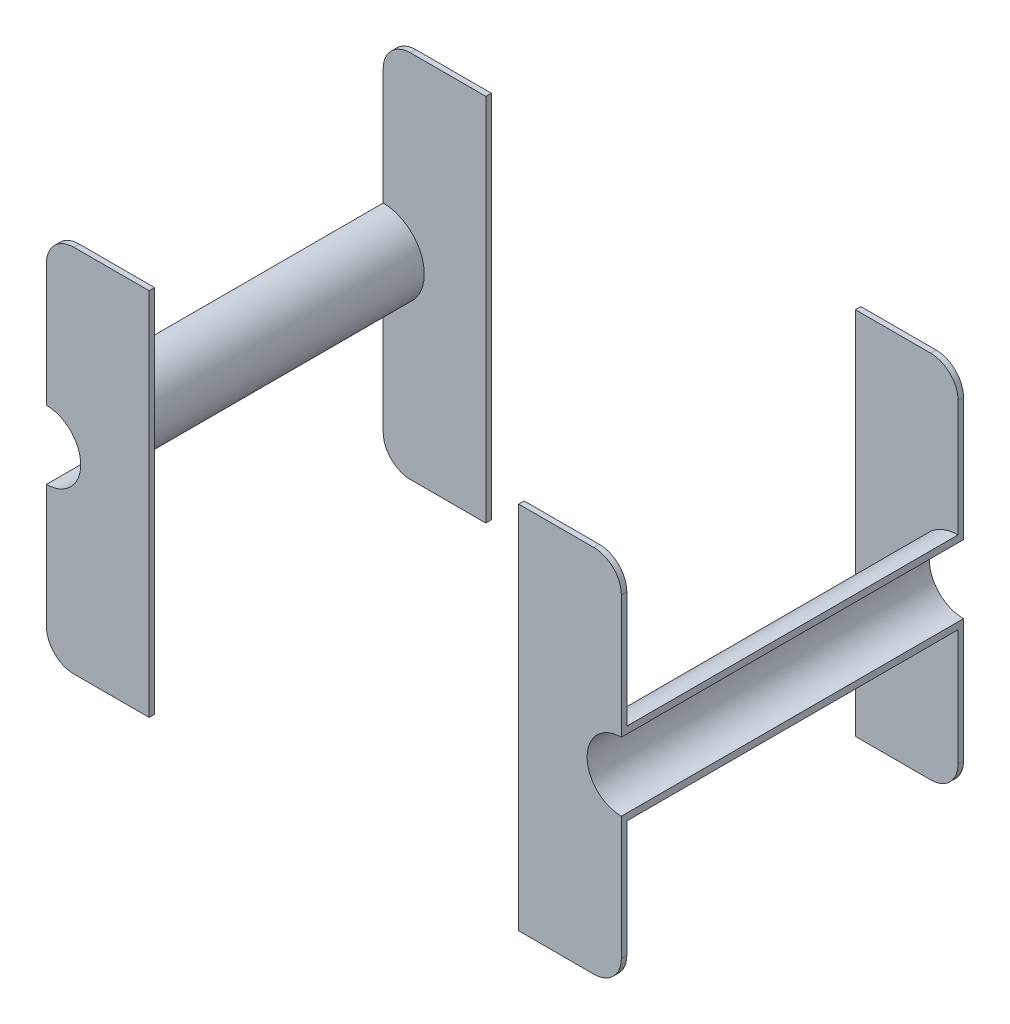
ISO-10303-21;
HEADER;
FILE_DESCRIPTION(('STEP AP214'),'2;1');
FILE_NAME('part.step','',(''),(''),'','','');
FILE_SCHEMA(('AUTOMOTIVE_DESIGN { 1 0 10303 214 1 1 1 1 }'));
ENDSEC;
DATA;
#1=APPLICATION_CONTEXT('core data for automotive mechanical design processes');
#2=APPLICATION_PROTOCOL_DEFINITION('international standard','automotive_design',2000,#1);
#3=PRODUCT_CONTEXT('',#1,'mechanical');
#4=PRODUCT('Part','Part','',(#3));
#5=PRODUCT_RELATED_PRODUCT_CATEGORY('part','',(#4));
#6=PRODUCT_DEFINITION_FORMATION('','',#4);
#7=PRODUCT_DEFINITION_CONTEXT('part definition',#1,'design');
#8=PRODUCT_DEFINITION('design','',#6,#7);
#9=PRODUCT_DEFINITION_SHAPE('','',#8);
#10=(LENGTH_UNIT() NAMED_UNIT(*) SI_UNIT(.MILLI.,.METRE.));
#11=(NAMED_UNIT(*) PLANE_ANGLE_UNIT() SI_UNIT($,.RADIAN.));
#12=(NAMED_UNIT(*) SI_UNIT($,.STERADIAN.) SOLID_ANGLE_UNIT());
#13=UNCERTAINTY_MEASURE_WITH_UNIT(LENGTH_MEASURE(1.E-05),#10,'distance_accuracy_value','');
#14=(GEOMETRIC_REPRESENTATION_CONTEXT(3) GLOBAL_UNCERTAINTY_ASSIGNED_CONTEXT((#13)) GLOBAL_UNIT_ASSIGNED_CONTEXT((#10,
#11,#12)) REPRESENTATION_CONTEXT('',''));
#15=CARTESIAN_POINT('',(0.,0.,0.));
#16=DIRECTION('',(0.,0.,1.));
#17=DIRECTION('',(1.,0.,0.));
#18=AXIS2_PLACEMENT_3D('',#15,#16,#17);
#19=CARTESIAN_POINT('',(1.05,-0.675,0.));
#20=DIRECTION('',(1.,0.,0.));
#21=DIRECTION('',(0.,1.,0.));
#22=AXIS2_PLACEMENT_3D('',#19,#20,#21);
#23=PLANE('',#22);
#24=DIRECTION('',(0.,0.,-1.));
#25=VECTOR('',#24,1.);
#26=CARTESIAN_POINT('',(1.05,0.575,0.));
#27=LINE('',#26,#25);
#28=CARTESIAN_POINT('',(1.05,0.575,0.02));
#29=VERTEX_POINT('',#28);
#30=CARTESIAN_POINT('',(1.05,0.575,0.));
#31=VERTEX_POINT('',#30);
#32=EDGE_CURVE('P0_E338',#29,#31,#27,.T.);
#33=ORIENTED_EDGE('',*,*,#32,.F.);
#34=DIRECTION('',(0.,-1.,0.));
#35=VECTOR('',#34,1.);
#36=CARTESIAN_POINT('',(1.05,0.,0.02));
#37=LINE('',#36,#35);
#38=CARTESIAN_POINT('',(1.05,0.15,0.02));
#39=VERTEX_POINT('',#38);
#40=EDGE_CURVE('P0_E236',#29,#39,#37,.T.);
#41=ORIENTED_EDGE('',*,*,#40,.T.);
#42=DIRECTION('',(0.,0.,-1.));
#43=VECTOR('',#42,1.);
#44=CARTESIAN_POINT('',(1.05,0.15,1.25));
#45=LINE('',#44,#43);
#46=CARTESIAN_POINT('',(1.05,0.15,1.23));
#47=VERTEX_POINT('',#46);
#48=EDGE_CURVE('P0_E312',#47,#39,#45,.T.);
#49=ORIENTED_EDGE('',*,*,#48,.F.);
#50=DIRECTION('',(0.,1.,0.));
#51=VECTOR('',#50,1.);
#52=CARTESIAN_POINT('',(1.05,0.,1.23));
#53=LINE('',#52,#51);
#54=CARTESIAN_POINT('',(1.05,0.575,1.23));
#55=VERTEX_POINT('',#54);
#56=EDGE_CURVE('P0_E289',#47,#55,#53,.T.);
#57=ORIENTED_EDGE('',*,*,#56,.T.);
#58=DIRECTION('',(0.,0.,-1.));
#59=VECTOR('',#58,1.);
#60=CARTESIAN_POINT('',(1.05,0.575,0.));
#61=LINE('',#60,#59);
#62=CARTESIAN_POINT('',(1.05,0.575,1.25));
#63=VERTEX_POINT('',#62);
#64=EDGE_CURVE('P0_E265',#63,#55,#61,.T.);
#65=ORIENTED_EDGE('',*,*,#64,.F.);
#66=DIRECTION('',(0.,1.,0.));
#67=VECTOR('',#66,1.);
#68=CARTESIAN_POINT('',(1.05,-0.675,1.25));
#69=LINE('',#68,#67);
#70=CARTESIAN_POINT('',(1.05,0.125,1.25));
#71=VERTEX_POINT('',#70);
#72=EDGE_CURVE('P0_E170',#71,#63,#69,.T.);
#73=ORIENTED_EDGE('',*,*,#72,.F.);
#74=DIRECTION('',(0.,0.,-1.));
#75=VECTOR('',#74,1.);
#76=CARTESIAN_POINT('',(1.05,0.125,1.25));
#77=LINE('',#76,#75);
#78=CARTESIAN_POINT('',(1.05,0.125,0.));
#79=VERTEX_POINT('',#78);
#80=EDGE_CURVE('P0_E11',#71,#79,#77,.T.);
#81=ORIENTED_EDGE('',*,*,#80,.T.);
#82=DIRECTION('',(0.,1.,0.));
#83=VECTOR('',#82,1.);
#84=CARTESIAN_POINT('',(1.05,-0.675,0.));
#85=LINE('',#84,#83);
#86=EDGE_CURVE('P0_E167',#79,#31,#85,.T.);
#87=ORIENTED_EDGE('',*,*,#86,.T.);
#88=EDGE_LOOP('',(#33,#41,#49,#57,#65,#73,#81,#87));
#89=FACE_BOUND('',#88,.T.);
#90=ADVANCED_FACE('P0_F17',(#89),#23,.T.);
#91=CARTESIAN_POINT('',(1.05,0.,1.25));
#92=DIRECTION('',(0.,0.,1.));
#93=DIRECTION('',(-1.,0.,0.));
#94=AXIS2_PLACEMENT_3D('',#91,#92,#93);
#95=CYLINDRICAL_SURFACE('',#94,0.125);
#96=ORIENTED_EDGE('',*,*,#80,.F.);
#97=CARTESIAN_POINT('',(1.05,0.,1.25));
#98=DIRECTION('',(0.,0.,-1.));
#99=DIRECTION('',(-1.,0.,0.));
#100=AXIS2_PLACEMENT_3D('',#97,#98,#99);
#101=CIRCLE('',#100,0.125);
#102=CARTESIAN_POINT('',(1.05,-0.125,1.25));
#103=VERTEX_POINT('',#102);
#104=EDGE_CURVE('P0_E308',#103,#71,#101,.T.);
#105=ORIENTED_EDGE('',*,*,#104,.F.);
#106=DIRECTION('',(0.,0.,1.));
#107=VECTOR('',#106,1.);
#108=CARTESIAN_POINT('',(1.05,-0.125,1.25));
#109=LINE('',#108,#107);
#110=CARTESIAN_POINT('',(1.05,-0.125,0.));
#111=VERTEX_POINT('',#110);
#112=EDGE_CURVE('P0_E176',#111,#103,#109,.T.);
#113=ORIENTED_EDGE('',*,*,#112,.F.);
#114=CARTESIAN_POINT('',(1.05,0.,0.));
#115=DIRECTION('',(0.,0.,1.));
#116=DIRECTION('',(-1.,0.,0.));
#117=AXIS2_PLACEMENT_3D('',#114,#115,#116);
#118=CIRCLE('',#117,0.125);
#119=EDGE_CURVE('P0_E173',#79,#111,#118,.T.);
#120=ORIENTED_EDGE('',*,*,#119,.F.);
#121=EDGE_LOOP('',(#96,#105,#113,#120));
#122=FACE_BOUND('',#121,.T.);
#123=ADVANCED_FACE('P0_F174',(#122),#95,.F.);
#124=CARTESIAN_POINT('',(0.675,0.675,1.25));
#125=DIRECTION('',(1.,0.,0.));
#126=DIRECTION('',(0.,1.,0.));
#127=AXIS2_PLACEMENT_3D('',#124,#125,#126);
#128=PLANE('',#127);
#129=DIRECTION('',(0.,-1.,0.));
#130=VECTOR('',#129,1.);
#131=CARTESIAN_POINT('',(0.675,0.3375,1.25));
#132=LINE('',#131,#130);
#133=CARTESIAN_POINT('',(0.675,0.675,1.25));
#134=VERTEX_POINT('',#133);
#135=CARTESIAN_POINT('',(0.675,-0.675,1.25));
#136=VERTEX_POINT('',#135);
#137=EDGE_CURVE('P0_E299',#134,#136,#132,.T.);
#138=ORIENTED_EDGE('',*,*,#137,.F.);
#139=DIRECTION('',(0.,0.,1.));
#140=VECTOR('',#139,1.);
#141=CARTESIAN_POINT('',(0.675,0.675,0.625));
#142=LINE('',#141,#140);
#143=CARTESIAN_POINT('',(0.675,0.675,1.23));
#144=VERTEX_POINT('',#143);
#145=EDGE_CURVE('P0_E281',#144,#134,#142,.T.);
#146=ORIENTED_EDGE('',*,*,#145,.F.);
#147=DIRECTION('',(0.,-1.,0.));
#148=VECTOR('',#147,1.);
#149=CARTESIAN_POINT('',(0.675,-0.675,1.23));
#150=LINE('',#149,#148);
#151=CARTESIAN_POINT('',(0.675,-0.675,1.23));
#152=VERTEX_POINT('',#151);
#153=EDGE_CURVE('P0_E242',#144,#152,#150,.T.);
#154=ORIENTED_EDGE('',*,*,#153,.T.);
#155=DIRECTION('',(0.,0.,-1.));
#156=VECTOR('',#155,1.);
#157=CARTESIAN_POINT('',(0.675,-0.675,0.625));
#158=LINE('',#157,#156);
#159=EDGE_CURVE('P0_E26',#136,#152,#158,.T.);
#160=ORIENTED_EDGE('',*,*,#159,.F.);
#161=EDGE_LOOP('',(#138,#146,#154,#160));
#162=FACE_BOUND('',#161,.T.);
#163=ADVANCED_FACE('P0_F369',(#162),#128,.F.);
#164=CARTESIAN_POINT('',(-1.05,-0.675,0.));
#165=DIRECTION('',(0.,-1.,0.));
#166=DIRECTION('',(0.,0.,-1.));
#167=AXIS2_PLACEMENT_3D('',#164,#165,#166);
#168=PLANE('',#167);
#169=DIRECTION('',(0.,0.,-1.));
#170=VECTOR('',#169,1.);
#171=CARTESIAN_POINT('',(0.95,-0.675,0.));
#172=LINE('',#171,#170);
#173=CARTESIAN_POINT('',(0.95,-0.675,1.25));
#174=VERTEX_POINT('',#173);
#175=CARTESIAN_POINT('',(0.95,-0.675,1.23));
#176=VERTEX_POINT('',#175);
#177=EDGE_CURVE('P0_E241',#174,#176,#172,.T.);
#178=ORIENTED_EDGE('',*,*,#177,.F.);
#179=DIRECTION('',(1.,0.,0.));
#180=VECTOR('',#179,1.);
#181=CARTESIAN_POINT('',(-1.05,-0.675,1.25));
#182=LINE('',#181,#180);
#183=EDGE_CURVE('P0_E303',#136,#174,#182,.T.);
#184=ORIENTED_EDGE('',*,*,#183,.F.);
#185=ORIENTED_EDGE('',*,*,#159,.T.);
#186=DIRECTION('',(1.,0.,0.));
#187=VECTOR('',#186,1.);
#188=CARTESIAN_POINT('',(-1.05,-0.675,1.23));
#189=LINE('',#188,#187);
#190=EDGE_CURVE('P0_E298',#152,#176,#189,.T.);
#191=ORIENTED_EDGE('',*,*,#190,.T.);
#192=EDGE_LOOP('',(#178,#184,#185,#191));
#193=FACE_BOUND('',#192,.T.);
#194=ADVANCED_FACE('P0_F359',(#193),#168,.T.);
#195=CARTESIAN_POINT('',(-1.05,-0.675,0.));
#196=DIRECTION('',(0.,-1.,0.));
#197=DIRECTION('',(0.,0.,-1.));
#198=AXIS2_PLACEMENT_3D('',#195,#196,#197);
#199=PLANE('',#198);
#200=DIRECTION('',(0.,0.,-1.));
#201=VECTOR('',#200,1.);
#202=CARTESIAN_POINT('',(0.95,-0.675,0.));
#203=LINE('',#202,#201);
#204=CARTESIAN_POINT('',(0.95,-0.675,0.02));
#205=VERTEX_POINT('',#204);
#206=CARTESIAN_POINT('',(0.95,-0.675,0.));
#207=VERTEX_POINT('',#206);
#208=EDGE_CURVE('P0_E202',#205,#207,#203,.T.);
#209=ORIENTED_EDGE('',*,*,#208,.F.);
#210=DIRECTION('',(-1.,0.,0.));
#211=VECTOR('',#210,1.);
#212=CARTESIAN_POINT('',(0.,-0.675,0.02));
#213=LINE('',#212,#211);
#214=CARTESIAN_POINT('',(0.675,-0.675,0.02));
#215=VERTEX_POINT('',#214);
#216=EDGE_CURVE('P0_E225',#205,#215,#213,.T.);
#217=ORIENTED_EDGE('',*,*,#216,.T.);
#218=DIRECTION('',(0.,0.,-1.));
#219=VECTOR('',#218,1.);
#220=CARTESIAN_POINT('',(0.675,-0.675,0.));
#221=LINE('',#220,#219);
#222=CARTESIAN_POINT('',(0.675,-0.675,0.));
#223=VERTEX_POINT('',#222);
#224=EDGE_CURVE('P0_E20',#215,#223,#221,.T.);
#225=ORIENTED_EDGE('',*,*,#224,.T.);
#226=DIRECTION('',(1.,0.,0.));
#227=VECTOR('',#226,1.);
#228=CARTESIAN_POINT('',(-1.05,-0.675,0.));
#229=LINE('',#228,#227);
#230=EDGE_CURVE('P0_E210',#223,#207,#229,.T.);
#231=ORIENTED_EDGE('',*,*,#230,.T.);
#232=EDGE_LOOP('',(#209,#217,#225,#231));
#233=FACE_BOUND('',#232,.T.);
#234=ADVANCED_FACE('P0_F356',(#233),#199,.T.);
#235=CARTESIAN_POINT('',(0.675,-0.675,0.));
#236=DIRECTION('',(1.,0.,0.));
#237=DIRECTION('',(0.,1.,0.));
#238=AXIS2_PLACEMENT_3D('',#235,#236,#237);
#239=PLANE('',#238);
#240=DIRECTION('',(0.,1.,0.));
#241=VECTOR('',#240,1.);
#242=CARTESIAN_POINT('',(0.675,-0.3375,0.));
#243=LINE('',#242,#241);
#244=CARTESIAN_POINT('',(0.675,0.675,0.));
#245=VERTEX_POINT('',#244);
#246=EDGE_CURVE('P0_E207',#223,#245,#243,.T.);
#247=ORIENTED_EDGE('',*,*,#246,.F.);
#248=ORIENTED_EDGE('',*,*,#224,.F.);
#249=DIRECTION('',(0.,1.,0.));
#250=VECTOR('',#249,1.);
#251=CARTESIAN_POINT('',(0.675,-0.675,0.02));
#252=LINE('',#251,#250);
#253=CARTESIAN_POINT('',(0.675,0.675,0.02));
#254=VERTEX_POINT('',#253);
#255=EDGE_CURVE('P0_E222',#215,#254,#252,.T.);
#256=ORIENTED_EDGE('',*,*,#255,.T.);
#257=DIRECTION('',(0.,0.,1.));
#258=VECTOR('',#257,1.);
#259=CARTESIAN_POINT('',(0.675,0.675,0.));
#260=LINE('',#259,#258);
#261=EDGE_CURVE('P0_E194',#245,#254,#260,.T.);
#262=ORIENTED_EDGE('',*,*,#261,.F.);
#263=EDGE_LOOP('',(#247,#248,#256,#262));
#264=FACE_BOUND('',#263,.T.);
#265=ADVANCED_FACE('P0_F358',(#264),#239,.F.);
#266=CARTESIAN_POINT('',(1.05,0.,1.25));
#267=DIRECTION('',(0.,0.,-1.));
#268=DIRECTION('',(0.,1.,0.));
#269=AXIS2_PLACEMENT_3D('',#266,#267,#268);
#270=CYLINDRICAL_SURFACE('',#269,0.15);
#271=CARTESIAN_POINT('',(1.05,0.,1.23));
#272=DIRECTION('',(0.,0.,1.));
#273=DIRECTION('',(0.,1.,0.));
#274=AXIS2_PLACEMENT_3D('',#271,#272,#273);
#275=CIRCLE('',#274,0.15);
#276=CARTESIAN_POINT('',(1.05,-0.15,1.23));
#277=VERTEX_POINT('',#276);
#278=EDGE_CURVE('P0_E292',#47,#277,#275,.T.);
#279=ORIENTED_EDGE('',*,*,#278,.F.);
#280=ORIENTED_EDGE('',*,*,#48,.T.);
#281=CARTESIAN_POINT('',(1.05,0.,0.02));
#282=DIRECTION('',(0.,0.,-1.));
#283=DIRECTION('',(0.,1.,0.));
#284=AXIS2_PLACEMENT_3D('',#281,#282,#283);
#285=CIRCLE('',#284,0.15);
#286=CARTESIAN_POINT('',(1.05,-0.15,0.02));
#287=VERTEX_POINT('',#286);
#288=EDGE_CURVE('P0_E232',#287,#39,#285,.T.);
#289=ORIENTED_EDGE('',*,*,#288,.F.);
#290=DIRECTION('',(0.,0.,-1.));
#291=VECTOR('',#290,1.);
#292=CARTESIAN_POINT('',(1.05,-0.15,1.25));
#293=LINE('',#292,#291);
#294=EDGE_CURVE('P0_E258',#277,#287,#293,.T.);
#295=ORIENTED_EDGE('',*,*,#294,.F.);
#296=EDGE_LOOP('',(#279,#280,#289,#295));
#297=FACE_BOUND('',#296,.T.);
#298=ADVANCED_FACE('P0_F366',(#297),#270,.T.);
#299=CARTESIAN_POINT('',(0.,0.,1.25));
#300=DIRECTION('',(0.,0.,1.));
#301=DIRECTION('',(1.,0.,0.));
#302=AXIS2_PLACEMENT_3D('',#299,#300,#301);
#303=PLANE('',#302);
#304=CARTESIAN_POINT('',(0.95,0.575,1.25));
#305=DIRECTION('',(0.,0.,-1.));
#306=DIRECTION('',(0.707106781186548,0.707106781186548,0.));
#307=AXIS2_PLACEMENT_3D('',#304,#305,#306);
#308=CIRCLE('',#307,0.1);
#309=CARTESIAN_POINT('',(0.95,0.675,1.25));
#310=VERTEX_POINT('',#309);
#311=EDGE_CURVE('P0_E261',#310,#63,#308,.T.);
#312=ORIENTED_EDGE('',*,*,#311,.F.);
#313=DIRECTION('',(-1.,0.,0.));
#314=VECTOR('',#313,1.);
#315=CARTESIAN_POINT('',(1.05,0.675,1.25));
#316=LINE('',#315,#314);
#317=EDGE_CURVE('P0_E285',#310,#134,#316,.T.);
#318=ORIENTED_EDGE('',*,*,#317,.T.);
#319=ORIENTED_EDGE('',*,*,#137,.T.);
#320=ORIENTED_EDGE('',*,*,#183,.T.);
#321=CARTESIAN_POINT('',(0.95,-0.575,1.25));
#322=DIRECTION('',(0.,0.,-1.));
#323=DIRECTION('',(0.707106781186548,-0.707106781186548,0.));
#324=AXIS2_PLACEMENT_3D('',#321,#322,#323);
#325=CIRCLE('',#324,0.1);
#326=CARTESIAN_POINT('',(1.05,-0.575,1.25));
#327=VERTEX_POINT('',#326);
#328=EDGE_CURVE('P0_E237',#327,#174,#325,.T.);
#329=ORIENTED_EDGE('',*,*,#328,.F.);
#330=DIRECTION('',(0.,1.,0.));
#331=VECTOR('',#330,1.);
#332=CARTESIAN_POINT('',(1.05,-0.675,1.25));
#333=LINE('',#332,#331);
#334=EDGE_CURVE('P0_E246',#327,#103,#333,.T.);
#335=ORIENTED_EDGE('',*,*,#334,.T.);
#336=ORIENTED_EDGE('',*,*,#104,.T.);
#337=ORIENTED_EDGE('',*,*,#72,.T.);
#338=EDGE_LOOP('',(#312,#318,#319,#320,#329,#335,#336,#337));
#339=FACE_BOUND('',#338,.T.);
#340=ADVANCED_FACE('P0_F384',(#339),#303,.T.);
#341=CARTESIAN_POINT('',(0.95,-0.575,0.));
#342=DIRECTION('',(0.,0.,1.));
#343=DIRECTION('',(0.707106781186548,-0.707106781186548,0.));
#344=AXIS2_PLACEMENT_3D('',#341,#342,#343);
#345=CYLINDRICAL_SURFACE('',#344,0.1);
#346=ORIENTED_EDGE('',*,*,#328,.T.);
#347=ORIENTED_EDGE('',*,*,#177,.T.);
#348=CARTESIAN_POINT('',(0.95,-0.575,1.23));
#349=DIRECTION('',(0.,0.,1.));
#350=DIRECTION('',(0.707106781186548,-0.707106781186548,0.));
#351=AXIS2_PLACEMENT_3D('',#348,#349,#350);
#352=CIRCLE('',#351,0.1);
#353=CARTESIAN_POINT('',(1.05,-0.575,1.23));
#354=VERTEX_POINT('',#353);
#355=EDGE_CURVE('P0_E295',#176,#354,#352,.T.);
#356=ORIENTED_EDGE('',*,*,#355,.T.);
#357=DIRECTION('',(0.,0.,1.));
#358=VECTOR('',#357,1.);
#359=CARTESIAN_POINT('',(1.05,-0.575,0.));
#360=LINE('',#359,#358);
#361=EDGE_CURVE('P0_E250',#354,#327,#360,.T.);
#362=ORIENTED_EDGE('',*,*,#361,.T.);
#363=EDGE_LOOP('',(#346,#347,#356,#362));
#364=FACE_BOUND('',#363,.T.);
#365=ADVANCED_FACE('P0_F386',(#364),#345,.T.);
#366=CARTESIAN_POINT('',(-1.05,0.675,1.23));
#367=DIRECTION('',(0.,0.,1.));
#368=DIRECTION('',(1.,0.,0.));
#369=AXIS2_PLACEMENT_3D('',#366,#367,#368);
#370=PLANE('',#369);
#371=CARTESIAN_POINT('',(0.95,0.575,1.23));
#372=DIRECTION('',(0.,0.,1.));
#373=DIRECTION('',(0.707106781186548,0.707106781186548,0.));
#374=AXIS2_PLACEMENT_3D('',#371,#372,#373);
#375=CIRCLE('',#374,0.1);
#376=CARTESIAN_POINT('',(0.95,0.675,1.23));
#377=VERTEX_POINT('',#376);
#378=EDGE_CURVE('P0_E269',#55,#377,#375,.T.);
#379=ORIENTED_EDGE('',*,*,#378,.F.);
#380=ORIENTED_EDGE('',*,*,#56,.F.);
#381=ORIENTED_EDGE('',*,*,#278,.T.);
#382=DIRECTION('',(0.,1.,0.));
#383=VECTOR('',#382,1.);
#384=CARTESIAN_POINT('',(1.05,0.,1.23));
#385=LINE('',#384,#383);
#386=EDGE_CURVE('P0_E254',#354,#277,#385,.T.);
#387=ORIENTED_EDGE('',*,*,#386,.F.);
#388=ORIENTED_EDGE('',*,*,#355,.F.);
#389=ORIENTED_EDGE('',*,*,#190,.F.);
#390=ORIENTED_EDGE('',*,*,#153,.F.);
#391=DIRECTION('',(-1.,0.,0.));
#392=VECTOR('',#391,1.);
#393=CARTESIAN_POINT('',(0.,0.675,1.23));
#394=LINE('',#393,#392);
#395=EDGE_CURVE('P0_E277',#377,#144,#394,.T.);
#396=ORIENTED_EDGE('',*,*,#395,.F.);
#397=EDGE_LOOP('',(#379,#380,#381,#387,#388,#389,#390,#396));
#398=FACE_BOUND('',#397,.T.);
#399=ADVANCED_FACE('P0_F392',(#398),#370,.F.);
#400=CARTESIAN_POINT('',(1.05,0.675,0.));
#401=DIRECTION('',(0.,1.,0.));
#402=DIRECTION('',(1.,0.,0.));
#403=AXIS2_PLACEMENT_3D('',#400,#401,#402);
#404=PLANE('',#403);
#405=DIRECTION('',(0.,0.,1.));
#406=VECTOR('',#405,1.);
#407=CARTESIAN_POINT('',(0.95,0.675,0.));
#408=LINE('',#407,#406);
#409=EDGE_CURVE('P0_E273',#377,#310,#408,.T.);
#410=ORIENTED_EDGE('',*,*,#409,.F.);
#411=ORIENTED_EDGE('',*,*,#395,.T.);
#412=ORIENTED_EDGE('',*,*,#145,.T.);
#413=ORIENTED_EDGE('',*,*,#317,.F.);
#414=EDGE_LOOP('',(#410,#411,#412,#413));
#415=FACE_BOUND('',#414,.T.);
#416=ADVANCED_FACE('P0_F402',(#415),#404,.T.);
#417=CARTESIAN_POINT('',(0.95,0.575,0.));
#418=DIRECTION('',(0.,0.,1.));
#419=DIRECTION('',(0.707106781186548,0.707106781186548,0.));
#420=AXIS2_PLACEMENT_3D('',#417,#418,#419);
#421=CYLINDRICAL_SURFACE('',#420,0.1);
#422=ORIENTED_EDGE('',*,*,#311,.T.);
#423=ORIENTED_EDGE('',*,*,#64,.T.);
#424=ORIENTED_EDGE('',*,*,#378,.T.);
#425=ORIENTED_EDGE('',*,*,#409,.T.);
#426=EDGE_LOOP('',(#422,#423,#424,#425));
#427=FACE_BOUND('',#426,.T.);
#428=ADVANCED_FACE('P0_F398',(#427),#421,.T.);
#429=CARTESIAN_POINT('',(1.05,-0.675,0.));
#430=DIRECTION('',(1.,0.,0.));
#431=DIRECTION('',(0.,1.,0.));
#432=AXIS2_PLACEMENT_3D('',#429,#430,#431);
#433=PLANE('',#432);
#434=DIRECTION('',(0.,0.,1.));
#435=VECTOR('',#434,1.);
#436=CARTESIAN_POINT('',(1.05,-0.575,0.));
#437=LINE('',#436,#435);
#438=CARTESIAN_POINT('',(1.05,-0.575,0.));
#439=VERTEX_POINT('',#438);
#440=CARTESIAN_POINT('',(1.05,-0.575,0.02));
#441=VERTEX_POINT('',#440);
#442=EDGE_CURVE('P0_E203',#439,#441,#437,.T.);
#443=ORIENTED_EDGE('',*,*,#442,.F.);
#444=DIRECTION('',(0.,1.,0.));
#445=VECTOR('',#444,1.);
#446=CARTESIAN_POINT('',(1.05,-0.675,0.));
#447=LINE('',#446,#445);
#448=EDGE_CURVE('P0_E181',#439,#111,#447,.T.);
#449=ORIENTED_EDGE('',*,*,#448,.T.);
#450=ORIENTED_EDGE('',*,*,#112,.T.);
#451=ORIENTED_EDGE('',*,*,#334,.F.);
#452=ORIENTED_EDGE('',*,*,#361,.F.);
#453=ORIENTED_EDGE('',*,*,#386,.T.);
#454=ORIENTED_EDGE('',*,*,#294,.T.);
#455=DIRECTION('',(0.,-1.,0.));
#456=VECTOR('',#455,1.);
#457=CARTESIAN_POINT('',(1.05,0.,0.02));
#458=LINE('',#457,#456);
#459=EDGE_CURVE('P0_E229',#287,#441,#458,.T.);
#460=ORIENTED_EDGE('',*,*,#459,.T.);
#461=EDGE_LOOP('',(#443,#449,#450,#451,#452,#453,#454,#460));
#462=FACE_BOUND('',#461,.T.);
#463=ADVANCED_FACE('P0_F348',(#462),#433,.T.);
#464=CARTESIAN_POINT('',(1.05,0.675,0.02));
#465=DIRECTION('',(0.,0.,-1.));
#466=DIRECTION('',(0.,-1.,0.));
#467=AXIS2_PLACEMENT_3D('',#464,#465,#466);
#468=PLANE('',#467);
#469=CARTESIAN_POINT('',(0.95,0.575,0.02));
#470=DIRECTION('',(0.,0.,-1.));
#471=DIRECTION('',(0.707106781186548,0.707106781186548,0.));
#472=AXIS2_PLACEMENT_3D('',#469,#470,#471);
#473=CIRCLE('',#472,0.1);
#474=CARTESIAN_POINT('',(0.95,0.675,0.02));
#475=VERTEX_POINT('',#474);
#476=EDGE_CURVE('P0_E331',#475,#29,#473,.T.);
#477=ORIENTED_EDGE('',*,*,#476,.F.);
#478=DIRECTION('',(1.,0.,0.));
#479=VECTOR('',#478,1.);
#480=CARTESIAN_POINT('',(1.05,0.675,0.02));
#481=LINE('',#480,#479);
#482=EDGE_CURVE('P0_E188',#254,#475,#481,.T.);
#483=ORIENTED_EDGE('',*,*,#482,.F.);
#484=ORIENTED_EDGE('',*,*,#255,.F.);
#485=ORIENTED_EDGE('',*,*,#216,.F.);
#486=CARTESIAN_POINT('',(0.95,-0.575,0.02));
#487=DIRECTION('',(0.,0.,-1.));
#488=DIRECTION('',(0.707106781186548,-0.707106781186548,0.));
#489=AXIS2_PLACEMENT_3D('',#486,#487,#488);
#490=CIRCLE('',#489,0.1);
#491=EDGE_CURVE('P0_E198',#441,#205,#490,.T.);
#492=ORIENTED_EDGE('',*,*,#491,.F.);
#493=ORIENTED_EDGE('',*,*,#459,.F.);
#494=ORIENTED_EDGE('',*,*,#288,.T.);
#495=ORIENTED_EDGE('',*,*,#40,.F.);
#496=EDGE_LOOP('',(#477,#483,#484,#485,#492,#493,#494,#495));
#497=FACE_BOUND('',#496,.T.);
#498=ADVANCED_FACE('P0_F414',(#497),#468,.F.);
#499=CARTESIAN_POINT('',(0.95,-0.575,0.));
#500=DIRECTION('',(0.,0.,1.));
#501=DIRECTION('',(0.707106781186548,-0.707106781186548,0.));
#502=AXIS2_PLACEMENT_3D('',#499,#500,#501);
#503=CYLINDRICAL_SURFACE('',#502,0.1);
#504=CARTESIAN_POINT('',(0.95,-0.575,0.));
#505=DIRECTION('',(0.,0.,1.));
#506=DIRECTION('',(0.707106781186548,-0.707106781186548,0.));
#507=AXIS2_PLACEMENT_3D('',#504,#505,#506);
#508=CIRCLE('',#507,0.1);
#509=EDGE_CURVE('P0_E206',#207,#439,#508,.T.);
#510=ORIENTED_EDGE('',*,*,#509,.T.);
#511=ORIENTED_EDGE('',*,*,#442,.T.);
#512=ORIENTED_EDGE('',*,*,#491,.T.);
#513=ORIENTED_EDGE('',*,*,#208,.T.);
#514=EDGE_LOOP('',(#510,#511,#512,#513));
#515=FACE_BOUND('',#514,.T.);
#516=ADVANCED_FACE('P0_F353',(#515),#503,.T.);
#517=CARTESIAN_POINT('',(0.,0.,0.));
#518=DIRECTION('',(0.,0.,1.));
#519=DIRECTION('',(1.,0.,0.));
#520=AXIS2_PLACEMENT_3D('',#517,#518,#519);
#521=PLANE('',#520);
#522=CARTESIAN_POINT('',(0.95,0.575,0.));
#523=DIRECTION('',(0.,0.,1.));
#524=DIRECTION('',(0.707106781186548,0.707106781186548,0.));
#525=AXIS2_PLACEMENT_3D('',#522,#523,#524);
#526=CIRCLE('',#525,0.1);
#527=CARTESIAN_POINT('',(0.95,0.675,0.));
#528=VERTEX_POINT('',#527);
#529=EDGE_CURVE('P0_E186',#31,#528,#526,.T.);
#530=ORIENTED_EDGE('',*,*,#529,.F.);
#531=ORIENTED_EDGE('',*,*,#86,.F.);
#532=ORIENTED_EDGE('',*,*,#119,.T.);
#533=ORIENTED_EDGE('',*,*,#448,.F.);
#534=ORIENTED_EDGE('',*,*,#509,.F.);
#535=ORIENTED_EDGE('',*,*,#230,.F.);
#536=ORIENTED_EDGE('',*,*,#246,.T.);
#537=DIRECTION('',(-1.,0.,0.));
#538=VECTOR('',#537,1.);
#539=CARTESIAN_POINT('',(1.05,0.675,0.));
#540=LINE('',#539,#538);
#541=EDGE_CURVE('P0_E334',#528,#245,#540,.T.);
#542=ORIENTED_EDGE('',*,*,#541,.F.);
#543=EDGE_LOOP('',(#530,#531,#532,#533,#534,#535,#536,#542));
#544=FACE_BOUND('',#543,.T.);
#545=ADVANCED_FACE('P0_F184',(#544),#521,.F.);
#546=CARTESIAN_POINT('',(1.05,0.675,0.));
#547=DIRECTION('',(0.,1.,0.));
#548=DIRECTION('',(1.,0.,0.));
#549=AXIS2_PLACEMENT_3D('',#546,#547,#548);
#550=PLANE('',#549);
#551=DIRECTION('',(0.,0.,1.));
#552=VECTOR('',#551,1.);
#553=CARTESIAN_POINT('',(0.95,0.675,0.));
#554=LINE('',#553,#552);
#555=EDGE_CURVE('P0_E421',#528,#475,#554,.T.);
#556=ORIENTED_EDGE('',*,*,#555,.F.);
#557=ORIENTED_EDGE('',*,*,#541,.T.);
#558=ORIENTED_EDGE('',*,*,#261,.T.);
#559=ORIENTED_EDGE('',*,*,#482,.T.);
#560=EDGE_LOOP('',(#556,#557,#558,#559));
#561=FACE_BOUND('',#560,.T.);
#562=ADVANCED_FACE('P0_F422',(#561),#550,.T.);
#563=CARTESIAN_POINT('',(0.95,0.575,0.));
#564=DIRECTION('',(0.,0.,1.));
#565=DIRECTION('',(0.707106781186548,0.707106781186548,0.));
#566=AXIS2_PLACEMENT_3D('',#563,#564,#565);
#567=CYLINDRICAL_SURFACE('',#566,0.1);
#568=ORIENTED_EDGE('',*,*,#529,.T.);
#569=ORIENTED_EDGE('',*,*,#555,.T.);
#570=ORIENTED_EDGE('',*,*,#476,.T.);
#571=ORIENTED_EDGE('',*,*,#32,.T.);
#572=EDGE_LOOP('',(#568,#569,#570,#571));
#573=FACE_BOUND('',#572,.T.);
#574=ADVANCED_FACE('P0_F427',(#573),#567,.T.);
#575=CLOSED_SHELL('',(#90,#123,#163,#194,#234,#265,#298,#340,#365,#399,#416,#428,#463,#498,#516,
#545,#562,#574));
#576=MANIFOLD_SOLID_BREP('P0_B1',#575);
#577=CARTESIAN_POINT('',(-1.05,-0.675,0.));
#578=DIRECTION('',(0.,-1.,0.));
#579=DIRECTION('',(0.,0.,-1.));
#580=AXIS2_PLACEMENT_3D('',#577,#578,#579);
#581=PLANE('',#580);
#582=DIRECTION('',(0.,0.,1.));
#583=VECTOR('',#582,1.);
#584=CARTESIAN_POINT('',(-0.95,-0.675,0.));
#585=LINE('',#584,#583);
#586=CARTESIAN_POINT('',(-0.95,-0.675,1.23));
#587=VERTEX_POINT('',#586);
#588=CARTESIAN_POINT('',(-0.95,-0.675,1.25));
#589=VERTEX_POINT('',#588);
#590=EDGE_CURVE('P1_E180',#587,#589,#585,.T.);
#591=ORIENTED_EDGE('',*,*,#590,.F.);
#592=DIRECTION('',(1.,0.,0.));
#593=VECTOR('',#592,1.);
#594=CARTESIAN_POINT('',(-1.05,-0.675,1.23));
#595=LINE('',#594,#593);
#596=CARTESIAN_POINT('',(-0.675,-0.675,1.23));
#597=VERTEX_POINT('',#596);
#598=EDGE_CURVE('P1_E178',#587,#597,#595,.T.);
#599=ORIENTED_EDGE('',*,*,#598,.T.);
#600=DIRECTION('',(0.,0.,1.));
#601=VECTOR('',#600,1.);
#602=CARTESIAN_POINT('',(-0.675,-0.675,0.625));
#603=LINE('',#602,#601);
#604=CARTESIAN_POINT('',(-0.675,-0.675,1.25));
#605=VERTEX_POINT('',#604);
#606=EDGE_CURVE('P1_E11',#597,#605,#603,.T.);
#607=ORIENTED_EDGE('',*,*,#606,.T.);
#608=DIRECTION('',(1.,0.,0.));
#609=VECTOR('',#608,1.);
#610=CARTESIAN_POINT('',(-1.05,-0.675,1.25));
#611=LINE('',#610,#609);
#612=EDGE_CURVE('P1_E210',#589,#605,#611,.T.);
#613=ORIENTED_EDGE('',*,*,#612,.F.);
#614=EDGE_LOOP('',(#591,#599,#607,#613));
#615=FACE_BOUND('',#614,.T.);
#616=ADVANCED_FACE('P1_F17',(#615),#581,.T.);
#617=CARTESIAN_POINT('',(-0.675,-0.675,1.25));
#618=DIRECTION('',(-1.,0.,0.));
#619=DIRECTION('',(0.,0.,1.));
#620=AXIS2_PLACEMENT_3D('',#617,#618,#619);
#621=PLANE('',#620);
#622=DIRECTION('',(0.,1.,0.));
#623=VECTOR('',#622,1.);
#624=CARTESIAN_POINT('',(-0.675,-0.3375,1.25));
#625=LINE('',#624,#623);
#626=CARTESIAN_POINT('',(-0.675,0.675,1.25));
#627=VERTEX_POINT('',#626);
#628=EDGE_CURVE('P1_E174',#605,#627,#625,.T.);
#629=ORIENTED_EDGE('',*,*,#628,.F.);
#630=ORIENTED_EDGE('',*,*,#606,.F.);
#631=DIRECTION('',(0.,1.,0.));
#632=VECTOR('',#631,1.);
#633=CARTESIAN_POINT('',(-0.675,0.675,1.23));
#634=LINE('',#633,#632);
#635=CARTESIAN_POINT('',(-0.675,0.675,1.23));
#636=VERTEX_POINT('',#635);
#637=EDGE_CURVE('P1_E171',#597,#636,#634,.T.);
#638=ORIENTED_EDGE('',*,*,#637,.T.);
#639=DIRECTION('',(0.,0.,-1.));
#640=VECTOR('',#639,1.);
#641=CARTESIAN_POINT('',(-0.675,0.675,0.625));
#642=LINE('',#641,#640);
#643=EDGE_CURVE('P1_E26',#627,#636,#642,.T.);
#644=ORIENTED_EDGE('',*,*,#643,.F.);
#645=EDGE_LOOP('',(#629,#630,#638,#644));
#646=FACE_BOUND('',#645,.T.);
#647=ADVANCED_FACE('P1_F169',(#646),#621,.F.);
#648=CARTESIAN_POINT('',(1.05,0.675,0.));
#649=DIRECTION('',(0.,1.,0.));
#650=DIRECTION('',(1.,0.,0.));
#651=AXIS2_PLACEMENT_3D('',#648,#649,#650);
#652=PLANE('',#651);
#653=DIRECTION('',(0.,0.,-1.));
#654=VECTOR('',#653,1.);
#655=CARTESIAN_POINT('',(-0.95,0.675,0.));
#656=LINE('',#655,#654);
#657=CARTESIAN_POINT('',(-0.95,0.675,1.25));
#658=VERTEX_POINT('',#657);
#659=CARTESIAN_POINT('',(-0.95,0.675,1.23));
#660=VERTEX_POINT('',#659);
#661=EDGE_CURVE('P1_E290',#658,#660,#656,.T.);
#662=ORIENTED_EDGE('',*,*,#661,.F.);
#663=DIRECTION('',(-1.,0.,0.));
#664=VECTOR('',#663,1.);
#665=CARTESIAN_POINT('',(1.05,0.675,1.25));
#666=LINE('',#665,#664);
#667=EDGE_CURVE('P1_E215',#627,#658,#666,.T.);
#668=ORIENTED_EDGE('',*,*,#667,.F.);
#669=ORIENTED_EDGE('',*,*,#643,.T.);
#670=DIRECTION('',(-1.,0.,0.));
#671=VECTOR('',#670,1.);
#672=CARTESIAN_POINT('',(0.,0.675,1.23));
#673=LINE('',#672,#671);
#674=EDGE_CURVE('P1_E188',#636,#660,#673,.T.);
#675=ORIENTED_EDGE('',*,*,#674,.T.);
#676=EDGE_LOOP('',(#662,#668,#669,#675));
#677=FACE_BOUND('',#676,.T.);
#678=ADVANCED_FACE('P1_F316',(#677),#652,.T.);
#679=CARTESIAN_POINT('',(-1.05,0.,1.25));
#680=DIRECTION('',(0.,0.,1.));
#681=DIRECTION('',(-1.,0.,0.));
#682=AXIS2_PLACEMENT_3D('',#679,#680,#681);
#683=CYLINDRICAL_SURFACE('',#682,0.125);
#684=DIRECTION('',(0.,0.,-1.));
#685=VECTOR('',#684,1.);
#686=CARTESIAN_POINT('',(-1.05,-0.125,1.25));
#687=LINE('',#686,#685);
#688=CARTESIAN_POINT('',(-1.05,-0.125,1.25));
#689=VERTEX_POINT('',#688);
#690=CARTESIAN_POINT('',(-1.05,-0.125,0.));
#691=VERTEX_POINT('',#690);
#692=EDGE_CURVE('P1_E337',#689,#691,#687,.T.);
#693=ORIENTED_EDGE('',*,*,#692,.F.);
#694=CARTESIAN_POINT('',(-1.05,0.,1.25));
#695=DIRECTION('',(0.,0.,-1.));
#696=DIRECTION('',(-1.,0.,0.));
#697=AXIS2_PLACEMENT_3D('',#694,#695,#696);
#698=CIRCLE('',#697,0.125);
#699=CARTESIAN_POINT('',(-1.05,0.125,1.25));
#700=VERTEX_POINT('',#699);
#701=EDGE_CURVE('P1_E207',#700,#689,#698,.T.);
#702=ORIENTED_EDGE('',*,*,#701,.F.);
#703=DIRECTION('',(0.,0.,1.));
#704=VECTOR('',#703,1.);
#705=CARTESIAN_POINT('',(-1.05,0.125,1.25));
#706=LINE('',#705,#704);
#707=CARTESIAN_POINT('',(-1.05,0.125,0.));
#708=VERTEX_POINT('',#707);
#709=EDGE_CURVE('P1_E267',#708,#700,#706,.T.);
#710=ORIENTED_EDGE('',*,*,#709,.F.);
#711=CARTESIAN_POINT('',(-1.05,0.,0.));
#712=DIRECTION('',(0.,0.,1.));
#713=DIRECTION('',(-1.,0.,0.));
#714=AXIS2_PLACEMENT_3D('',#711,#712,#713);
#715=CIRCLE('',#714,0.125);
#716=EDGE_CURVE('P1_E216',#691,#708,#715,.T.);
#717=ORIENTED_EDGE('',*,*,#716,.F.);
#718=EDGE_LOOP('',(#693,#702,#710,#717));
#719=FACE_BOUND('',#718,.T.);
#720=ADVANCED_FACE('P1_F399',(#719),#683,.F.);
#721=CARTESIAN_POINT('',(-0.675,0.675,0.));
#722=DIRECTION('',(-1.,0.,0.));
#723=DIRECTION('',(0.,0.,1.));
#724=AXIS2_PLACEMENT_3D('',#721,#722,#723);
#725=PLANE('',#724);
#726=DIRECTION('',(0.,-1.,0.));
#727=VECTOR('',#726,1.);
#728=CARTESIAN_POINT('',(-0.675,0.3375,0.));
#729=LINE('',#728,#727);
#730=CARTESIAN_POINT('',(-0.675,0.675,0.));
#731=VERTEX_POINT('',#730);
#732=CARTESIAN_POINT('',(-0.675,-0.675,0.));
#733=VERTEX_POINT('',#732);
#734=EDGE_CURVE('P1_E222',#731,#733,#729,.T.);
#735=ORIENTED_EDGE('',*,*,#734,.F.);
#736=DIRECTION('',(0.,0.,-1.));
#737=VECTOR('',#736,1.);
#738=CARTESIAN_POINT('',(-0.675,0.675,0.));
#739=LINE('',#738,#737);
#740=CARTESIAN_POINT('',(-0.675,0.675,0.02));
#741=VERTEX_POINT('',#740);
#742=EDGE_CURVE('P1_E20',#741,#731,#739,.T.);
#743=ORIENTED_EDGE('',*,*,#742,.F.);
#744=DIRECTION('',(0.,-1.,0.));
#745=VECTOR('',#744,1.);
#746=CARTESIAN_POINT('',(-0.675,0.675,0.02));
#747=LINE('',#746,#745);
#748=CARTESIAN_POINT('',(-0.675,-0.675,0.02));
#749=VERTEX_POINT('',#748);
#750=EDGE_CURVE('P1_E344',#741,#749,#747,.T.);
#751=ORIENTED_EDGE('',*,*,#750,.T.);
#752=DIRECTION('',(0.,0.,1.));
#753=VECTOR('',#752,1.);
#754=CARTESIAN_POINT('',(-0.675,-0.675,0.));
#755=LINE('',#754,#753);
#756=EDGE_CURVE('P1_E39',#733,#749,#755,.T.);
#757=ORIENTED_EDGE('',*,*,#756,.F.);
#758=EDGE_LOOP('',(#735,#743,#751,#757));
#759=FACE_BOUND('',#758,.T.);
#760=ADVANCED_FACE('P1_F406',(#759),#725,.F.);
#761=CARTESIAN_POINT('',(1.05,0.675,0.));
#762=DIRECTION('',(0.,1.,0.));
#763=DIRECTION('',(1.,0.,0.));
#764=AXIS2_PLACEMENT_3D('',#761,#762,#763);
#765=PLANE('',#764);
#766=DIRECTION('',(0.,0.,-1.));
#767=VECTOR('',#766,1.);
#768=CARTESIAN_POINT('',(-0.95,0.675,0.));
#769=LINE('',#768,#767);
#770=CARTESIAN_POINT('',(-0.95,0.675,0.02));
#771=VERTEX_POINT('',#770);
#772=CARTESIAN_POINT('',(-0.95,0.675,0.));
#773=VERTEX_POINT('',#772);
#774=EDGE_CURVE('P1_E253',#771,#773,#769,.T.);
#775=ORIENTED_EDGE('',*,*,#774,.F.);
#776=DIRECTION('',(1.,0.,0.));
#777=VECTOR('',#776,1.);
#778=CARTESIAN_POINT('',(1.05,0.675,0.02));
#779=LINE('',#778,#777);
#780=EDGE_CURVE('P1_E245',#771,#741,#779,.T.);
#781=ORIENTED_EDGE('',*,*,#780,.T.);
#782=ORIENTED_EDGE('',*,*,#742,.T.);
#783=DIRECTION('',(-1.,0.,0.));
#784=VECTOR('',#783,1.);
#785=CARTESIAN_POINT('',(1.05,0.675,0.));
#786=LINE('',#785,#784);
#787=EDGE_CURVE('P1_E219',#731,#773,#786,.T.);
#788=ORIENTED_EDGE('',*,*,#787,.T.);
#789=EDGE_LOOP('',(#775,#781,#782,#788));
#790=FACE_BOUND('',#789,.T.);
#791=ADVANCED_FACE('P1_F404',(#790),#765,.T.);
#792=CARTESIAN_POINT('',(-1.05,-0.675,0.));
#793=DIRECTION('',(0.,-1.,0.));
#794=DIRECTION('',(0.,0.,-1.));
#795=AXIS2_PLACEMENT_3D('',#792,#793,#794);
#796=PLANE('',#795);
#797=DIRECTION('',(0.,0.,1.));
#798=VECTOR('',#797,1.);
#799=CARTESIAN_POINT('',(-0.95,-0.675,0.));
#800=LINE('',#799,#798);
#801=CARTESIAN_POINT('',(-0.95,-0.675,0.));
#802=VERTEX_POINT('',#801);
#803=CARTESIAN_POINT('',(-0.95,-0.675,0.02));
#804=VERTEX_POINT('',#803);
#805=EDGE_CURVE('P1_E365',#802,#804,#800,.T.);
#806=ORIENTED_EDGE('',*,*,#805,.F.);
#807=DIRECTION('',(1.,0.,0.));
#808=VECTOR('',#807,1.);
#809=CARTESIAN_POINT('',(-1.05,-0.675,0.));
#810=LINE('',#809,#808);
#811=EDGE_CURVE('P1_E225',#802,#733,#810,.T.);
#812=ORIENTED_EDGE('',*,*,#811,.T.);
#813=ORIENTED_EDGE('',*,*,#756,.T.);
#814=DIRECTION('',(-1.,0.,0.));
#815=VECTOR('',#814,1.);
#816=CARTESIAN_POINT('',(0.,-0.675,0.02));
#817=LINE('',#816,#815);
#818=EDGE_CURVE('P1_E238',#749,#804,#817,.T.);
#819=ORIENTED_EDGE('',*,*,#818,.T.);
#820=EDGE_LOOP('',(#806,#812,#813,#819));
#821=FACE_BOUND('',#820,.T.);
#822=ADVANCED_FACE('P1_F385',(#821),#796,.T.);
#823=CARTESIAN_POINT('',(0.,0.,0.));
#824=DIRECTION('',(0.,0.,1.));
#825=DIRECTION('',(1.,0.,0.));
#826=AXIS2_PLACEMENT_3D('',#823,#824,#825);
#827=PLANE('',#826);
#828=CARTESIAN_POINT('',(-0.95,-0.575,0.));
#829=DIRECTION('',(0.,0.,1.));
#830=DIRECTION('',(-0.707106781186548,-0.707106781186548,0.));
#831=AXIS2_PLACEMENT_3D('',#828,#829,#830);
#832=CIRCLE('',#831,0.1);
#833=CARTESIAN_POINT('',(-1.05,-0.575,0.));
#834=VERTEX_POINT('',#833);
#835=EDGE_CURVE('P1_E372',#834,#802,#832,.T.);
#836=ORIENTED_EDGE('',*,*,#835,.F.);
#837=DIRECTION('',(0.,-1.,0.));
#838=VECTOR('',#837,1.);
#839=CARTESIAN_POINT('',(-1.05,0.675,0.));
#840=LINE('',#839,#838);
#841=EDGE_CURVE('P1_E340',#691,#834,#840,.T.);
#842=ORIENTED_EDGE('',*,*,#841,.F.);
#843=ORIENTED_EDGE('',*,*,#716,.T.);
#844=DIRECTION('',(0.,-1.,0.));
#845=VECTOR('',#844,1.);
#846=CARTESIAN_POINT('',(-1.05,0.675,0.));
#847=LINE('',#846,#845);
#848=CARTESIAN_POINT('',(-1.05,0.575,0.));
#849=VERTEX_POINT('',#848);
#850=EDGE_CURVE('P1_E263',#849,#708,#847,.T.);
#851=ORIENTED_EDGE('',*,*,#850,.F.);
#852=CARTESIAN_POINT('',(-0.95,0.575,0.));
#853=DIRECTION('',(0.,0.,1.));
#854=DIRECTION('',(-0.707106781186548,0.707106781186548,0.));
#855=AXIS2_PLACEMENT_3D('',#852,#853,#854);
#856=CIRCLE('',#855,0.1);
#857=EDGE_CURVE('P1_E254',#773,#849,#856,.T.);
#858=ORIENTED_EDGE('',*,*,#857,.F.);
#859=ORIENTED_EDGE('',*,*,#787,.F.);
#860=ORIENTED_EDGE('',*,*,#734,.T.);
#861=ORIENTED_EDGE('',*,*,#811,.F.);
#862=EDGE_LOOP('',(#836,#842,#843,#851,#858,#859,#860,#861));
#863=FACE_BOUND('',#862,.T.);
#864=ADVANCED_FACE('P1_F383',(#863),#827,.F.);
#865=CARTESIAN_POINT('',(-1.05,0.,1.25));
#866=DIRECTION('',(0.,0.,1.));
#867=DIRECTION('',(0.,1.,0.));
#868=AXIS2_PLACEMENT_3D('',#865,#866,#867);
#869=CYLINDRICAL_SURFACE('',#868,0.15);
#870=CARTESIAN_POINT('',(-1.05,0.,1.23));
#871=DIRECTION('',(0.,0.,1.));
#872=DIRECTION('',(0.,1.,0.));
#873=AXIS2_PLACEMENT_3D('',#870,#871,#872);
#874=CIRCLE('',#873,0.15);
#875=CARTESIAN_POINT('',(-1.05,-0.15,1.23));
#876=VERTEX_POINT('',#875);
#877=CARTESIAN_POINT('',(-1.05,0.15,1.23));
#878=VERTEX_POINT('',#877);
#879=EDGE_CURVE('P1_E201',#876,#878,#874,.T.);
#880=ORIENTED_EDGE('',*,*,#879,.F.);
#881=DIRECTION('',(0.,0.,-1.));
#882=VECTOR('',#881,1.);
#883=CARTESIAN_POINT('',(-1.05,-0.15,1.25));
#884=LINE('',#883,#882);
#885=CARTESIAN_POINT('',(-1.05,-0.15,0.02));
#886=VERTEX_POINT('',#885);
#887=EDGE_CURVE('P1_E332',#876,#886,#884,.T.);
#888=ORIENTED_EDGE('',*,*,#887,.T.);
#889=CARTESIAN_POINT('',(-1.05,0.,0.02));
#890=DIRECTION('',(0.,0.,-1.));
#891=DIRECTION('',(0.,1.,0.));
#892=AXIS2_PLACEMENT_3D('',#889,#890,#891);
#893=CIRCLE('',#892,0.15);
#894=CARTESIAN_POINT('',(-1.05,0.15,0.02));
#895=VERTEX_POINT('',#894);
#896=EDGE_CURVE('P1_E249',#895,#886,#893,.T.);
#897=ORIENTED_EDGE('',*,*,#896,.F.);
#898=DIRECTION('',(0.,0.,-1.));
#899=VECTOR('',#898,1.);
#900=CARTESIAN_POINT('',(-1.05,0.15,1.25));
#901=LINE('',#900,#899);
#902=EDGE_CURVE('P1_E283',#878,#895,#901,.T.);
#903=ORIENTED_EDGE('',*,*,#902,.F.);
#904=EDGE_LOOP('',(#880,#888,#897,#903));
#905=FACE_BOUND('',#904,.T.);
#906=ADVANCED_FACE('P1_F437',(#905),#869,.T.);
#907=CARTESIAN_POINT('',(0.,0.,1.25));
#908=DIRECTION('',(0.,0.,1.));
#909=DIRECTION('',(1.,0.,0.));
#910=AXIS2_PLACEMENT_3D('',#907,#908,#909);
#911=PLANE('',#910);
#912=CARTESIAN_POINT('',(-0.95,0.575,1.25));
#913=DIRECTION('',(0.,0.,-1.));
#914=DIRECTION('',(-0.707106781186548,0.707106781186548,0.));
#915=AXIS2_PLACEMENT_3D('',#912,#913,#914);
#916=CIRCLE('',#915,0.1);
#917=CARTESIAN_POINT('',(-1.05,0.575,1.25));
#918=VERTEX_POINT('',#917);
#919=EDGE_CURVE('P1_E285',#918,#658,#916,.T.);
#920=ORIENTED_EDGE('',*,*,#919,.F.);
#921=DIRECTION('',(0.,-1.,0.));
#922=VECTOR('',#921,1.);
#923=CARTESIAN_POINT('',(-1.05,0.675,1.25));
#924=LINE('',#923,#922);
#925=EDGE_CURVE('P1_E271',#918,#700,#924,.T.);
#926=ORIENTED_EDGE('',*,*,#925,.T.);
#927=ORIENTED_EDGE('',*,*,#701,.T.);
#928=DIRECTION('',(0.,-1.,0.));
#929=VECTOR('',#928,1.);
#930=CARTESIAN_POINT('',(-1.05,0.675,1.25));
#931=LINE('',#930,#929);
#932=CARTESIAN_POINT('',(-1.05,-0.575,1.25));
#933=VERTEX_POINT('',#932);
#934=EDGE_CURVE('P1_E336',#689,#933,#931,.T.);
#935=ORIENTED_EDGE('',*,*,#934,.T.);
#936=CARTESIAN_POINT('',(-0.95,-0.575,1.25));
#937=DIRECTION('',(0.,0.,-1.));
#938=DIRECTION('',(-0.707106781186548,-0.707106781186548,0.));
#939=AXIS2_PLACEMENT_3D('',#936,#937,#938);
#940=CIRCLE('',#939,0.1);
#941=EDGE_CURVE('P1_E204',#589,#933,#940,.T.);
#942=ORIENTED_EDGE('',*,*,#941,.F.);
#943=ORIENTED_EDGE('',*,*,#612,.T.);
#944=ORIENTED_EDGE('',*,*,#628,.T.);
#945=ORIENTED_EDGE('',*,*,#667,.T.);
#946=EDGE_LOOP('',(#920,#926,#927,#935,#942,#943,#944,#945));
#947=FACE_BOUND('',#946,.T.);
#948=ADVANCED_FACE('P1_F309',(#947),#911,.T.);
#949=CARTESIAN_POINT('',(-0.95,-0.575,0.));
#950=DIRECTION('',(0.,0.,1.));
#951=DIRECTION('',(-0.707106781186548,-0.707106781186548,0.));
#952=AXIS2_PLACEMENT_3D('',#949,#950,#951);
#953=CYLINDRICAL_SURFACE('',#952,0.1);
#954=ORIENTED_EDGE('',*,*,#941,.T.);
#955=DIRECTION('',(0.,0.,-1.));
#956=VECTOR('',#955,1.);
#957=CARTESIAN_POINT('',(-1.05,-0.575,0.));
#958=LINE('',#957,#956);
#959=CARTESIAN_POINT('',(-1.05,-0.575,1.23));
#960=VERTEX_POINT('',#959);
#961=EDGE_CURVE('P1_E331',#933,#960,#958,.T.);
#962=ORIENTED_EDGE('',*,*,#961,.T.);
#963=CARTESIAN_POINT('',(-0.95,-0.575,1.23));
#964=DIRECTION('',(0.,0.,1.));
#965=DIRECTION('',(-0.707106781186548,-0.707106781186548,0.));
#966=AXIS2_PLACEMENT_3D('',#963,#964,#965);
#967=CIRCLE('',#966,0.1);
#968=EDGE_CURVE('P1_E184',#960,#587,#967,.T.);
#969=ORIENTED_EDGE('',*,*,#968,.T.);
#970=ORIENTED_EDGE('',*,*,#590,.T.);
#971=EDGE_LOOP('',(#954,#962,#969,#970));
#972=FACE_BOUND('',#971,.T.);
#973=ADVANCED_FACE('P1_F440',(#972),#953,.T.);
#974=CARTESIAN_POINT('',(-1.05,0.675,1.23));
#975=DIRECTION('',(0.,0.,1.));
#976=DIRECTION('',(1.,0.,0.));
#977=AXIS2_PLACEMENT_3D('',#974,#975,#976);
#978=PLANE('',#977);
#979=CARTESIAN_POINT('',(-0.95,0.575,1.23));
#980=DIRECTION('',(0.,0.,1.));
#981=DIRECTION('',(-0.707106781186548,0.707106781186548,0.));
#982=AXIS2_PLACEMENT_3D('',#979,#980,#981);
#983=CIRCLE('',#982,0.1);
#984=CARTESIAN_POINT('',(-1.05,0.575,1.23));
#985=VERTEX_POINT('',#984);
#986=EDGE_CURVE('P1_E195',#660,#985,#983,.T.);
#987=ORIENTED_EDGE('',*,*,#986,.F.);
#988=ORIENTED_EDGE('',*,*,#674,.F.);
#989=ORIENTED_EDGE('',*,*,#637,.F.);
#990=ORIENTED_EDGE('',*,*,#598,.F.);
#991=ORIENTED_EDGE('',*,*,#968,.F.);
#992=DIRECTION('',(0.,-1.,0.));
#993=VECTOR('',#992,1.);
#994=CARTESIAN_POINT('',(-1.05,0.675,1.23));
#995=LINE('',#994,#993);
#996=EDGE_CURVE('P1_E327',#876,#960,#995,.T.);
#997=ORIENTED_EDGE('',*,*,#996,.F.);
#998=ORIENTED_EDGE('',*,*,#879,.T.);
#999=DIRECTION('',(0.,-1.,0.));
#1000=VECTOR('',#999,1.);
#1001=CARTESIAN_POINT('',(-1.05,0.675,1.23));
#1002=LINE('',#1001,#1000);
#1003=EDGE_CURVE('P1_E279',#985,#878,#1002,.T.);
#1004=ORIENTED_EDGE('',*,*,#1003,.F.);
#1005=EDGE_LOOP('',(#987,#988,#989,#990,#991,#997,#998,#1004));
#1006=FACE_BOUND('',#1005,.T.);
#1007=ADVANCED_FACE('P1_F187',(#1006),#978,.F.);
#1008=CARTESIAN_POINT('',(-0.95,0.575,0.));
#1009=DIRECTION('',(0.,0.,1.));
#1010=DIRECTION('',(-0.707106781186548,0.707106781186548,0.));
#1011=AXIS2_PLACEMENT_3D('',#1008,#1009,#1010);
#1012=CYLINDRICAL_SURFACE('',#1011,0.1);
#1013=ORIENTED_EDGE('',*,*,#919,.T.);
#1014=ORIENTED_EDGE('',*,*,#661,.T.);
#1015=ORIENTED_EDGE('',*,*,#986,.T.);
#1016=DIRECTION('',(0.,0.,1.));
#1017=VECTOR('',#1016,1.);
#1018=CARTESIAN_POINT('',(-1.05,0.575,0.));
#1019=LINE('',#1018,#1017);
#1020=EDGE_CURVE('P1_E275',#985,#918,#1019,.T.);
#1021=ORIENTED_EDGE('',*,*,#1020,.T.);
#1022=EDGE_LOOP('',(#1013,#1014,#1015,#1021));
#1023=FACE_BOUND('',#1022,.T.);
#1024=ADVANCED_FACE('P1_F298',(#1023),#1012,.T.);
#1025=CARTESIAN_POINT('',(-1.05,0.675,0.));
#1026=DIRECTION('',(-1.,0.,0.));
#1027=DIRECTION('',(0.,0.,1.));
#1028=AXIS2_PLACEMENT_3D('',#1025,#1026,#1027);
#1029=PLANE('',#1028);
#1030=DIRECTION('',(0.,0.,1.));
#1031=VECTOR('',#1030,1.);
#1032=CARTESIAN_POINT('',(-1.05,0.575,0.));
#1033=LINE('',#1032,#1031);
#1034=CARTESIAN_POINT('',(-1.05,0.575,0.02));
#1035=VERTEX_POINT('',#1034);
#1036=EDGE_CURVE('P1_E250',#849,#1035,#1033,.T.);
#1037=ORIENTED_EDGE('',*,*,#1036,.F.);
#1038=ORIENTED_EDGE('',*,*,#850,.T.);
#1039=ORIENTED_EDGE('',*,*,#709,.T.);
#1040=ORIENTED_EDGE('',*,*,#925,.F.);
#1041=ORIENTED_EDGE('',*,*,#1020,.F.);
#1042=ORIENTED_EDGE('',*,*,#1003,.T.);
#1043=ORIENTED_EDGE('',*,*,#902,.T.);
#1044=DIRECTION('',(0.,1.,0.));
#1045=VECTOR('',#1044,1.);
#1046=CARTESIAN_POINT('',(-1.05,0.675,0.02));
#1047=LINE('',#1046,#1045);
#1048=EDGE_CURVE('P1_E244',#895,#1035,#1047,.T.);
#1049=ORIENTED_EDGE('',*,*,#1048,.T.);
#1050=EDGE_LOOP('',(#1037,#1038,#1039,#1040,#1041,#1042,#1043,#1049));
#1051=FACE_BOUND('',#1050,.T.);
#1052=ADVANCED_FACE('P1_F306',(#1051),#1029,.T.);
#1053=CARTESIAN_POINT('',(-0.95,0.575,0.));
#1054=DIRECTION('',(0.,0.,1.));
#1055=DIRECTION('',(-0.707106781186548,0.707106781186548,0.));
#1056=AXIS2_PLACEMENT_3D('',#1053,#1054,#1055);
#1057=CYLINDRICAL_SURFACE('',#1056,0.1);
#1058=ORIENTED_EDGE('',*,*,#857,.T.);
#1059=ORIENTED_EDGE('',*,*,#1036,.T.);
#1060=CARTESIAN_POINT('',(-0.95,0.575,0.02));
#1061=DIRECTION('',(0.,0.,-1.));
#1062=DIRECTION('',(-0.707106781186548,0.707106781186548,0.));
#1063=AXIS2_PLACEMENT_3D('',#1060,#1061,#1062);
#1064=CIRCLE('',#1063,0.1);
#1065=EDGE_CURVE('P1_E240',#1035,#771,#1064,.T.);
#1066=ORIENTED_EDGE('',*,*,#1065,.T.);
#1067=ORIENTED_EDGE('',*,*,#774,.T.);
#1068=EDGE_LOOP('',(#1058,#1059,#1066,#1067));
#1069=FACE_BOUND('',#1068,.T.);
#1070=ADVANCED_FACE('P1_F403',(#1069),#1057,.T.);
#1071=CARTESIAN_POINT('',(1.05,0.675,0.02));
#1072=DIRECTION('',(0.,0.,-1.));
#1073=DIRECTION('',(0.,-1.,0.));
#1074=AXIS2_PLACEMENT_3D('',#1071,#1072,#1073);
#1075=PLANE('',#1074);
#1076=CARTESIAN_POINT('',(-0.95,-0.575,0.02));
#1077=DIRECTION('',(0.,0.,-1.));
#1078=DIRECTION('',(-0.707106781186548,-0.707106781186548,0.));
#1079=AXIS2_PLACEMENT_3D('',#1076,#1077,#1078);
#1080=CIRCLE('',#1079,0.1);
#1081=CARTESIAN_POINT('',(-1.05,-0.575,0.02));
#1082=VERTEX_POINT('',#1081);
#1083=EDGE_CURVE('P1_E361',#804,#1082,#1080,.T.);
#1084=ORIENTED_EDGE('',*,*,#1083,.F.);
#1085=ORIENTED_EDGE('',*,*,#818,.F.);
#1086=ORIENTED_EDGE('',*,*,#750,.F.);
#1087=ORIENTED_EDGE('',*,*,#780,.F.);
#1088=ORIENTED_EDGE('',*,*,#1065,.F.);
#1089=ORIENTED_EDGE('',*,*,#1048,.F.);
#1090=ORIENTED_EDGE('',*,*,#896,.T.);
#1091=DIRECTION('',(0.,1.,0.));
#1092=VECTOR('',#1091,1.);
#1093=CARTESIAN_POINT('',(-1.05,0.675,0.02));
#1094=LINE('',#1093,#1092);
#1095=EDGE_CURVE('P1_E323',#1082,#886,#1094,.T.);
#1096=ORIENTED_EDGE('',*,*,#1095,.F.);
#1097=EDGE_LOOP('',(#1084,#1085,#1086,#1087,#1088,#1089,#1090,#1096));
#1098=FACE_BOUND('',#1097,.T.);
#1099=ADVANCED_FACE('P1_F388',(#1098),#1075,.F.);
#1100=CARTESIAN_POINT('',(-1.05,0.675,0.));
#1101=DIRECTION('',(-1.,0.,0.));
#1102=DIRECTION('',(0.,0.,1.));
#1103=AXIS2_PLACEMENT_3D('',#1100,#1101,#1102);
#1104=PLANE('',#1103);
#1105=DIRECTION('',(0.,0.,-1.));
#1106=VECTOR('',#1105,1.);
#1107=CARTESIAN_POINT('',(-1.05,-0.575,0.));
#1108=LINE('',#1107,#1106);
#1109=EDGE_CURVE('P1_E357',#1082,#834,#1108,.T.);
#1110=ORIENTED_EDGE('',*,*,#1109,.F.);
#1111=ORIENTED_EDGE('',*,*,#1095,.T.);
#1112=ORIENTED_EDGE('',*,*,#887,.F.);
#1113=ORIENTED_EDGE('',*,*,#996,.T.);
#1114=ORIENTED_EDGE('',*,*,#961,.F.);
#1115=ORIENTED_EDGE('',*,*,#934,.F.);
#1116=ORIENTED_EDGE('',*,*,#692,.T.);
#1117=ORIENTED_EDGE('',*,*,#841,.T.);
#1118=EDGE_LOOP('',(#1110,#1111,#1112,#1113,#1114,#1115,#1116,#1117));
#1119=FACE_BOUND('',#1118,.T.);
#1120=ADVANCED_FACE('P1_F395',(#1119),#1104,.T.);
#1121=CARTESIAN_POINT('',(-0.95,-0.575,0.));
#1122=DIRECTION('',(0.,0.,1.));
#1123=DIRECTION('',(-0.707106781186548,-0.707106781186548,0.));
#1124=AXIS2_PLACEMENT_3D('',#1121,#1122,#1123);
#1125=CYLINDRICAL_SURFACE('',#1124,0.1);
#1126=ORIENTED_EDGE('',*,*,#835,.T.);
#1127=ORIENTED_EDGE('',*,*,#805,.T.);
#1128=ORIENTED_EDGE('',*,*,#1083,.T.);
#1129=ORIENTED_EDGE('',*,*,#1109,.T.);
#1130=EDGE_LOOP('',(#1126,#1127,#1128,#1129));
#1131=FACE_BOUND('',#1130,.T.);
#1132=ADVANCED_FACE('P1_F379',(#1131),#1125,.T.);
#1133=CLOSED_SHELL('',(#616,#647,#678,#720,#760,#791,#822,#864,#906,#948,#973,#1007,#1024,#1052,
#1070,#1099,#1120,#1132));
#1134=MANIFOLD_SOLID_BREP('P1_B1',#1133);
#1135=ADVANCED_BREP_SHAPE_REPRESENTATION('',(#18,#576,#1134),#14);
#1136=SHAPE_DEFINITION_REPRESENTATION(#9,#1135);
ENDSEC;
END-ISO-10303-21;
